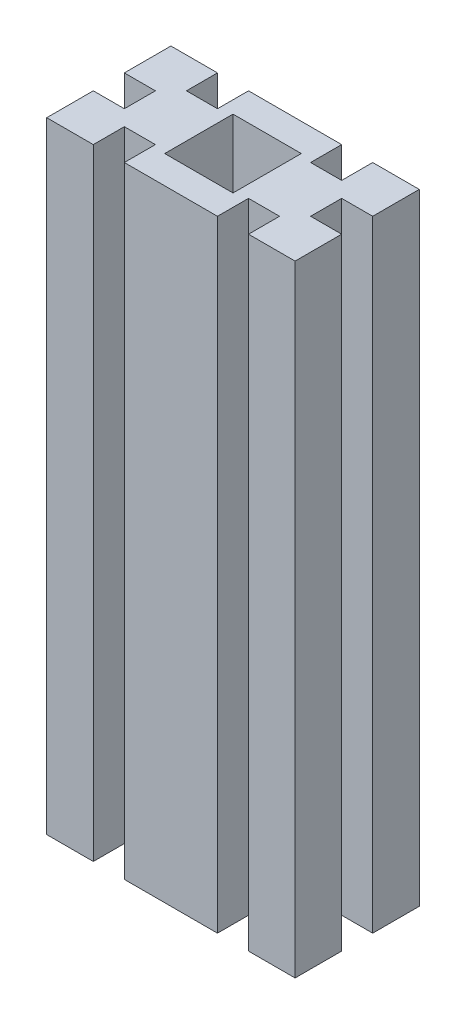
ISO-10303-21;
HEADER;
FILE_DESCRIPTION(('STEP AP214'),'2;1');
FILE_NAME('part.step','',(''),(''),'','','');
FILE_SCHEMA(('AUTOMOTIVE_DESIGN { 1 0 10303 214 1 1 1 1 }'));
ENDSEC;
DATA;
#1=APPLICATION_CONTEXT('core data for automotive mechanical design processes');
#2=APPLICATION_PROTOCOL_DEFINITION('international standard','automotive_design',2000,#1);
#3=PRODUCT_CONTEXT('',#1,'mechanical');
#4=PRODUCT('Part','Part','',(#3));
#5=PRODUCT_RELATED_PRODUCT_CATEGORY('part','',(#4));
#6=PRODUCT_DEFINITION_FORMATION('','',#4);
#7=PRODUCT_DEFINITION_CONTEXT('part definition',#1,'design');
#8=PRODUCT_DEFINITION('design','',#6,#7);
#9=PRODUCT_DEFINITION_SHAPE('','',#8);
#10=(LENGTH_UNIT() NAMED_UNIT(*) SI_UNIT(.MILLI.,.METRE.));
#11=(NAMED_UNIT(*) PLANE_ANGLE_UNIT() SI_UNIT($,.RADIAN.));
#12=(NAMED_UNIT(*) SI_UNIT($,.STERADIAN.) SOLID_ANGLE_UNIT());
#13=UNCERTAINTY_MEASURE_WITH_UNIT(LENGTH_MEASURE(1.E-05),#10,'distance_accuracy_value','');
#14=(GEOMETRIC_REPRESENTATION_CONTEXT(3) GLOBAL_UNCERTAINTY_ASSIGNED_CONTEXT((#13)) GLOBAL_UNIT_ASSIGNED_CONTEXT((#10,
#11,#12)) REPRESENTATION_CONTEXT('',''));
#15=CARTESIAN_POINT('',(0.,0.,0.));
#16=DIRECTION('',(0.,0.,1.));
#17=DIRECTION('',(1.,0.,0.));
#18=AXIS2_PLACEMENT_3D('',#15,#16,#17);
#19=CARTESIAN_POINT('',(-20.,100.,10.));
#20=DIRECTION('',(1.,0.,0.));
#21=DIRECTION('',(0.,0.,-1.));
#22=AXIS2_PLACEMENT_3D('',#19,#20,#21);
#23=PLANE('',#22);
#24=DIRECTION('',(0.,0.,1.));
#25=VECTOR('',#24,1.);
#26=CARTESIAN_POINT('',(-20.,0.,10.));
#27=LINE('',#26,#25);
#28=CARTESIAN_POINT('',(-20.,0.,-10.));
#29=VERTEX_POINT('',#28);
#30=CARTESIAN_POINT('',(-20.,0.,-2.5));
#31=VERTEX_POINT('',#30);
#32=EDGE_CURVE('E316',#29,#31,#27,.T.);
#33=ORIENTED_EDGE('',*,*,#32,.T.);
#34=DIRECTION('',(0.,1.,0.));
#35=VECTOR('',#34,1.);
#36=CARTESIAN_POINT('',(-20.,0.,-2.5));
#37=LINE('',#36,#35);
#38=CARTESIAN_POINT('',(-20.,100.,-2.5));
#39=VERTEX_POINT('',#38);
#40=EDGE_CURVE('E354',#31,#39,#37,.T.);
#41=ORIENTED_EDGE('',*,*,#40,.T.);
#42=DIRECTION('',(0.,0.,1.));
#43=VECTOR('',#42,1.);
#44=CARTESIAN_POINT('',(-20.,100.,10.));
#45=LINE('',#44,#43);
#46=CARTESIAN_POINT('',(-20.,100.,-10.));
#47=VERTEX_POINT('',#46);
#48=EDGE_CURVE('E335',#47,#39,#45,.T.);
#49=ORIENTED_EDGE('',*,*,#48,.F.);
#50=DIRECTION('',(0.,-1.,0.));
#51=VECTOR('',#50,1.);
#52=CARTESIAN_POINT('',(-20.,100.,-10.));
#53=LINE('',#52,#51);
#54=EDGE_CURVE('E279',#47,#29,#53,.T.);
#55=ORIENTED_EDGE('',*,*,#54,.T.);
#56=EDGE_LOOP('',(#33,#41,#49,#55));
#57=FACE_BOUND('',#56,.T.);
#58=ADVANCED_FACE('F33',(#57),#23,.F.);
#59=CARTESIAN_POINT('',(20.,100.,9.99999999999999));
#60=DIRECTION('',(0.,0.,-1.));
#61=DIRECTION('',(-1.,0.,0.));
#62=AXIS2_PLACEMENT_3D('',#59,#60,#61);
#63=PLANE('',#62);
#64=DIRECTION('',(1.,0.,0.));
#65=VECTOR('',#64,1.);
#66=CARTESIAN_POINT('',(20.,0.,9.99999999999999));
#67=LINE('',#66,#65);
#68=CARTESIAN_POINT('',(-20.,0.,10.));
#69=VERTEX_POINT('',#68);
#70=CARTESIAN_POINT('',(-12.5,0.,10.));
#71=VERTEX_POINT('',#70);
#72=EDGE_CURVE('E304',#69,#71,#67,.T.);
#73=ORIENTED_EDGE('',*,*,#72,.T.);
#74=DIRECTION('',(0.,1.,0.));
#75=VECTOR('',#74,1.);
#76=CARTESIAN_POINT('',(-12.5,0.,10.));
#77=LINE('',#76,#75);
#78=CARTESIAN_POINT('',(-12.5,100.,10.));
#79=VERTEX_POINT('',#78);
#80=EDGE_CURVE('E409',#71,#79,#77,.T.);
#81=ORIENTED_EDGE('',*,*,#80,.T.);
#82=DIRECTION('',(1.,0.,0.));
#83=VECTOR('',#82,1.);
#84=CARTESIAN_POINT('',(20.,100.,9.99999999999999));
#85=LINE('',#84,#83);
#86=CARTESIAN_POINT('',(-20.,100.,10.));
#87=VERTEX_POINT('',#86);
#88=EDGE_CURVE('E330',#87,#79,#85,.T.);
#89=ORIENTED_EDGE('',*,*,#88,.F.);
#90=DIRECTION('',(0.,-1.,0.));
#91=VECTOR('',#90,1.);
#92=CARTESIAN_POINT('',(-20.,100.,10.));
#93=LINE('',#92,#91);
#94=EDGE_CURVE('E11',#87,#69,#93,.T.);
#95=ORIENTED_EDGE('',*,*,#94,.T.);
#96=EDGE_LOOP('',(#73,#81,#89,#95));
#97=FACE_BOUND('',#96,.T.);
#98=ADVANCED_FACE('F547',(#97),#63,.F.);
#99=CARTESIAN_POINT('',(-7.5,100.,10.));
#100=VERTEX_POINT('',#99);
#101=CARTESIAN_POINT('',(7.5,100.,10.));
#102=VERTEX_POINT('',#101);
#103=EDGE_CURVE('E333',#100,#102,#85,.T.);
#104=ORIENTED_EDGE('',*,*,#103,.F.);
#105=DIRECTION('',(0.,1.,0.));
#106=VECTOR('',#105,1.);
#107=CARTESIAN_POINT('',(-7.5,0.,10.));
#108=LINE('',#107,#106);
#109=CARTESIAN_POINT('',(-7.5,0.,10.));
#110=VERTEX_POINT('',#109);
#111=EDGE_CURVE('E411',#110,#100,#108,.T.);
#112=ORIENTED_EDGE('',*,*,#111,.F.);
#113=CARTESIAN_POINT('',(7.5,0.,10.));
#114=VERTEX_POINT('',#113);
#115=EDGE_CURVE('E310',#110,#114,#67,.T.);
#116=ORIENTED_EDGE('',*,*,#115,.T.);
#117=DIRECTION('',(0.,1.,0.));
#118=VECTOR('',#117,1.);
#119=CARTESIAN_POINT('',(7.5,0.,10.));
#120=LINE('',#119,#118);
#121=EDGE_CURVE('E391',#114,#102,#120,.T.);
#122=ORIENTED_EDGE('',*,*,#121,.T.);
#123=EDGE_LOOP('',(#104,#112,#116,#122));
#124=FACE_BOUND('',#123,.T.);
#125=ADVANCED_FACE('F535',(#124),#63,.F.);
#126=CARTESIAN_POINT('',(20.,100.,9.99999999999999));
#127=DIRECTION('',(-1.,0.,0.));
#128=DIRECTION('',(0.,0.,1.));
#129=AXIS2_PLACEMENT_3D('',#126,#127,#128);
#130=PLANE('',#129);
#131=DIRECTION('',(0.,0.,-1.));
#132=VECTOR('',#131,1.);
#133=CARTESIAN_POINT('',(20.,100.,9.99999999999999));
#134=LINE('',#133,#132);
#135=CARTESIAN_POINT('',(20.,100.,-2.5));
#136=VERTEX_POINT('',#135);
#137=CARTESIAN_POINT('',(20.,100.,-10.));
#138=VERTEX_POINT('',#137);
#139=EDGE_CURVE('E329',#136,#138,#134,.T.);
#140=ORIENTED_EDGE('',*,*,#139,.F.);
#141=DIRECTION('',(0.,1.,0.));
#142=VECTOR('',#141,1.);
#143=CARTESIAN_POINT('',(20.,0.,-2.5));
#144=LINE('',#143,#142);
#145=CARTESIAN_POINT('',(20.,0.,-2.5));
#146=VERTEX_POINT('',#145);
#147=EDGE_CURVE('E366',#146,#136,#144,.T.);
#148=ORIENTED_EDGE('',*,*,#147,.F.);
#149=DIRECTION('',(0.,0.,-1.));
#150=VECTOR('',#149,1.);
#151=CARTESIAN_POINT('',(20.,0.,9.99999999999999));
#152=LINE('',#151,#150);
#153=CARTESIAN_POINT('',(20.,0.,-10.));
#154=VERTEX_POINT('',#153);
#155=EDGE_CURVE('E303',#146,#154,#152,.T.);
#156=ORIENTED_EDGE('',*,*,#155,.T.);
#157=DIRECTION('',(0.,-1.,0.));
#158=VECTOR('',#157,1.);
#159=CARTESIAN_POINT('',(20.,100.,-10.));
#160=LINE('',#159,#158);
#161=EDGE_CURVE('E282',#138,#154,#160,.T.);
#162=ORIENTED_EDGE('',*,*,#161,.F.);
#163=EDGE_LOOP('',(#140,#148,#156,#162));
#164=FACE_BOUND('',#163,.T.);
#165=ADVANCED_FACE('F516',(#164),#130,.F.);
#166=CARTESIAN_POINT('',(20.,100.,-10.));
#167=DIRECTION('',(0.,0.,1.));
#168=DIRECTION('',(1.,0.,0.));
#169=AXIS2_PLACEMENT_3D('',#166,#167,#168);
#170=PLANE('',#169);
#171=DIRECTION('',(-1.,0.,0.));
#172=VECTOR('',#171,1.);
#173=CARTESIAN_POINT('',(20.,0.,-10.));
#174=LINE('',#173,#172);
#175=CARTESIAN_POINT('',(12.5,0.,-10.));
#176=VERTEX_POINT('',#175);
#177=EDGE_CURVE('E270',#154,#176,#174,.T.);
#178=ORIENTED_EDGE('',*,*,#177,.T.);
#179=DIRECTION('',(0.,1.,0.));
#180=VECTOR('',#179,1.);
#181=CARTESIAN_POINT('',(12.5,0.,-10.));
#182=LINE('',#181,#180);
#183=CARTESIAN_POINT('',(12.5,100.,-10.));
#184=VERTEX_POINT('',#183);
#185=EDGE_CURVE('E378',#176,#184,#182,.T.);
#186=ORIENTED_EDGE('',*,*,#185,.T.);
#187=DIRECTION('',(-1.,0.,0.));
#188=VECTOR('',#187,1.);
#189=CARTESIAN_POINT('',(20.,100.,-10.));
#190=LINE('',#189,#188);
#191=EDGE_CURVE('E283',#138,#184,#190,.T.);
#192=ORIENTED_EDGE('',*,*,#191,.F.);
#193=ORIENTED_EDGE('',*,*,#161,.T.);
#194=EDGE_LOOP('',(#178,#186,#192,#193));
#195=FACE_BOUND('',#194,.T.);
#196=ADVANCED_FACE('F508',(#195),#170,.F.);
#197=CARTESIAN_POINT('',(-12.5,100.,-10.));
#198=VERTEX_POINT('',#197);
#199=EDGE_CURVE('E327',#198,#47,#190,.T.);
#200=ORIENTED_EDGE('',*,*,#199,.F.);
#201=DIRECTION('',(0.,1.,0.));
#202=VECTOR('',#201,1.);
#203=CARTESIAN_POINT('',(-12.5,0.,-10.));
#204=LINE('',#203,#202);
#205=CARTESIAN_POINT('',(-12.5,0.,-10.));
#206=VERTEX_POINT('',#205);
#207=EDGE_CURVE('E323',#206,#198,#204,.T.);
#208=ORIENTED_EDGE('',*,*,#207,.F.);
#209=EDGE_CURVE('E271',#206,#29,#174,.T.);
#210=ORIENTED_EDGE('',*,*,#209,.T.);
#211=ORIENTED_EDGE('',*,*,#54,.F.);
#212=EDGE_LOOP('',(#200,#208,#210,#211));
#213=FACE_BOUND('',#212,.T.);
#214=ADVANCED_FACE('F553',(#213),#170,.F.);
#215=CARTESIAN_POINT('',(-20.,100.,2.5));
#216=VERTEX_POINT('',#215);
#217=EDGE_CURVE('E274',#216,#87,#45,.T.);
#218=ORIENTED_EDGE('',*,*,#217,.F.);
#219=DIRECTION('',(0.,1.,0.));
#220=VECTOR('',#219,1.);
#221=CARTESIAN_POINT('',(-20.,0.,2.5));
#222=LINE('',#221,#220);
#223=CARTESIAN_POINT('',(-20.,0.,2.5));
#224=VERTEX_POINT('',#223);
#225=EDGE_CURVE('E434',#224,#216,#222,.T.);
#226=ORIENTED_EDGE('',*,*,#225,.F.);
#227=EDGE_CURVE('E319',#224,#69,#27,.T.);
#228=ORIENTED_EDGE('',*,*,#227,.T.);
#229=ORIENTED_EDGE('',*,*,#94,.F.);
#230=EDGE_LOOP('',(#218,#226,#228,#229));
#231=FACE_BOUND('',#230,.T.);
#232=ADVANCED_FACE('F35',(#231),#23,.F.);
#233=CARTESIAN_POINT('',(12.5,100.,10.));
#234=VERTEX_POINT('',#233);
#235=CARTESIAN_POINT('',(20.,100.,9.99999999999999));
#236=VERTEX_POINT('',#235);
#237=EDGE_CURVE('E334',#234,#236,#85,.T.);
#238=ORIENTED_EDGE('',*,*,#237,.F.);
#239=DIRECTION('',(0.,1.,0.));
#240=VECTOR('',#239,1.);
#241=CARTESIAN_POINT('',(12.5,0.,10.));
#242=LINE('',#241,#240);
#243=CARTESIAN_POINT('',(12.5,0.,10.));
#244=VERTEX_POINT('',#243);
#245=EDGE_CURVE('E384',#244,#234,#242,.T.);
#246=ORIENTED_EDGE('',*,*,#245,.F.);
#247=CARTESIAN_POINT('',(20.,0.,9.99999999999999));
#248=VERTEX_POINT('',#247);
#249=EDGE_CURVE('E300',#244,#248,#67,.T.);
#250=ORIENTED_EDGE('',*,*,#249,.T.);
#251=DIRECTION('',(0.,-1.,0.));
#252=VECTOR('',#251,1.);
#253=CARTESIAN_POINT('',(20.,100.,9.99999999999999));
#254=LINE('',#253,#252);
#255=EDGE_CURVE('E41',#236,#248,#254,.T.);
#256=ORIENTED_EDGE('',*,*,#255,.F.);
#257=EDGE_LOOP('',(#238,#246,#250,#256));
#258=FACE_BOUND('',#257,.T.);
#259=ADVANCED_FACE('F545',(#258),#63,.F.);
#260=CARTESIAN_POINT('',(20.,0.,2.5));
#261=VERTEX_POINT('',#260);
#262=EDGE_CURVE('E275',#248,#261,#152,.T.);
#263=ORIENTED_EDGE('',*,*,#262,.T.);
#264=DIRECTION('',(0.,1.,0.));
#265=VECTOR('',#264,1.);
#266=CARTESIAN_POINT('',(20.,0.,2.5));
#267=LINE('',#266,#265);
#268=CARTESIAN_POINT('',(20.,100.,2.5));
#269=VERTEX_POINT('',#268);
#270=EDGE_CURVE('E364',#261,#269,#267,.T.);
#271=ORIENTED_EDGE('',*,*,#270,.T.);
#272=EDGE_CURVE('E294',#236,#269,#134,.T.);
#273=ORIENTED_EDGE('',*,*,#272,.F.);
#274=ORIENTED_EDGE('',*,*,#255,.T.);
#275=EDGE_LOOP('',(#263,#271,#273,#274));
#276=FACE_BOUND('',#275,.T.);
#277=ADVANCED_FACE('F291',(#276),#130,.F.);
#278=CARTESIAN_POINT('',(7.5,100.,-10.));
#279=VERTEX_POINT('',#278);
#280=CARTESIAN_POINT('',(-7.5,100.,-10.));
#281=VERTEX_POINT('',#280);
#282=EDGE_CURVE('E262',#279,#281,#190,.T.);
#283=ORIENTED_EDGE('',*,*,#282,.F.);
#284=DIRECTION('',(0.,1.,0.));
#285=VECTOR('',#284,1.);
#286=CARTESIAN_POINT('',(7.5,0.,-10.));
#287=LINE('',#286,#285);
#288=CARTESIAN_POINT('',(7.5,0.,-10.));
#289=VERTEX_POINT('',#288);
#290=EDGE_CURVE('E246',#289,#279,#287,.T.);
#291=ORIENTED_EDGE('',*,*,#290,.F.);
#292=CARTESIAN_POINT('',(-7.5,0.,-10.));
#293=VERTEX_POINT('',#292);
#294=EDGE_CURVE('E260',#289,#293,#174,.T.);
#295=ORIENTED_EDGE('',*,*,#294,.T.);
#296=DIRECTION('',(0.,1.,0.));
#297=VECTOR('',#296,1.);
#298=CARTESIAN_POINT('',(-7.5,0.,-10.));
#299=LINE('',#298,#297);
#300=EDGE_CURVE('E342',#293,#281,#299,.T.);
#301=ORIENTED_EDGE('',*,*,#300,.T.);
#302=EDGE_LOOP('',(#283,#291,#295,#301));
#303=FACE_BOUND('',#302,.T.);
#304=ADVANCED_FACE('F258',(#303),#170,.F.);
#305=CARTESIAN_POINT('',(0.,100.,0.));
#306=DIRECTION('',(0.,1.,0.));
#307=DIRECTION('',(0.,0.,1.));
#308=AXIS2_PLACEMENT_3D('',#305,#306,#307);
#309=PLANE('',#308);
#310=DIRECTION('',(-1.,0.,0.));
#311=VECTOR('',#310,1.);
#312=CARTESIAN_POINT('',(-20.,100.,-2.5));
#313=LINE('',#312,#311);
#314=CARTESIAN_POINT('',(-15.,100.,-2.5));
#315=VERTEX_POINT('',#314);
#316=EDGE_CURVE('E442',#315,#39,#313,.T.);
#317=ORIENTED_EDGE('',*,*,#316,.F.);
#318=DIRECTION('',(0.,0.,-1.));
#319=VECTOR('',#318,1.);
#320=CARTESIAN_POINT('',(-15.,100.,-2.5));
#321=LINE('',#320,#319);
#322=CARTESIAN_POINT('',(-15.,100.,2.5));
#323=VERTEX_POINT('',#322);
#324=EDGE_CURVE('E445',#323,#315,#321,.T.);
#325=ORIENTED_EDGE('',*,*,#324,.F.);
#326=DIRECTION('',(1.,0.,0.));
#327=VECTOR('',#326,1.);
#328=CARTESIAN_POINT('',(-20.,100.,2.5));
#329=LINE('',#328,#327);
#330=EDGE_CURVE('E418',#216,#323,#329,.T.);
#331=ORIENTED_EDGE('',*,*,#330,.F.);
#332=ORIENTED_EDGE('',*,*,#217,.T.);
#333=ORIENTED_EDGE('',*,*,#88,.T.);
#334=DIRECTION('',(0.,0.,1.));
#335=VECTOR('',#334,1.);
#336=CARTESIAN_POINT('',(-12.5,100.,10.));
#337=LINE('',#336,#335);
#338=CARTESIAN_POINT('',(-12.5,100.,5.));
#339=VERTEX_POINT('',#338);
#340=EDGE_CURVE('E394',#339,#79,#337,.T.);
#341=ORIENTED_EDGE('',*,*,#340,.F.);
#342=DIRECTION('',(-1.,0.,0.));
#343=VECTOR('',#342,1.);
#344=CARTESIAN_POINT('',(-12.5,100.,5.));
#345=LINE('',#344,#343);
#346=CARTESIAN_POINT('',(-7.5,100.,5.));
#347=VERTEX_POINT('',#346);
#348=EDGE_CURVE('E419',#347,#339,#345,.T.);
#349=ORIENTED_EDGE('',*,*,#348,.F.);
#350=DIRECTION('',(0.,0.,-1.));
#351=VECTOR('',#350,1.);
#352=CARTESIAN_POINT('',(-7.5,100.,10.));
#353=LINE('',#352,#351);
#354=EDGE_CURVE('E423',#100,#347,#353,.T.);
#355=ORIENTED_EDGE('',*,*,#354,.F.);
#356=ORIENTED_EDGE('',*,*,#103,.T.);
#357=DIRECTION('',(0.,0.,1.));
#358=VECTOR('',#357,1.);
#359=CARTESIAN_POINT('',(7.5,100.,10.));
#360=LINE('',#359,#358);
#361=CARTESIAN_POINT('',(7.5,100.,5.));
#362=VERTEX_POINT('',#361);
#363=EDGE_CURVE('E395',#362,#102,#360,.T.);
#364=ORIENTED_EDGE('',*,*,#363,.F.);
#365=DIRECTION('',(-1.,0.,0.));
#366=VECTOR('',#365,1.);
#367=CARTESIAN_POINT('',(12.5,100.,5.));
#368=LINE('',#367,#366);
#369=CARTESIAN_POINT('',(12.5,100.,5.));
#370=VERTEX_POINT('',#369);
#371=EDGE_CURVE('E398',#370,#362,#368,.T.);
#372=ORIENTED_EDGE('',*,*,#371,.F.);
#373=DIRECTION('',(0.,0.,-1.));
#374=VECTOR('',#373,1.);
#375=CARTESIAN_POINT('',(12.5,100.,10.));
#376=LINE('',#375,#374);
#377=EDGE_CURVE('E368',#234,#370,#376,.T.);
#378=ORIENTED_EDGE('',*,*,#377,.F.);
#379=ORIENTED_EDGE('',*,*,#237,.T.);
#380=ORIENTED_EDGE('',*,*,#272,.T.);
#381=DIRECTION('',(1.,0.,0.));
#382=VECTOR('',#381,1.);
#383=CARTESIAN_POINT('',(20.,100.,2.5));
#384=LINE('',#383,#382);
#385=CARTESIAN_POINT('',(15.,100.,2.5));
#386=VERTEX_POINT('',#385);
#387=EDGE_CURVE('E369',#386,#269,#384,.T.);
#388=ORIENTED_EDGE('',*,*,#387,.F.);
#389=DIRECTION('',(0.,0.,1.));
#390=VECTOR('',#389,1.);
#391=CARTESIAN_POINT('',(15.,100.,-2.5));
#392=LINE('',#391,#390);
#393=CARTESIAN_POINT('',(15.,100.,-2.5));
#394=VERTEX_POINT('',#393);
#395=EDGE_CURVE('E372',#394,#386,#392,.T.);
#396=ORIENTED_EDGE('',*,*,#395,.F.);
#397=DIRECTION('',(-1.,0.,0.));
#398=VECTOR('',#397,1.);
#399=CARTESIAN_POINT('',(20.,100.,-2.5));
#400=LINE('',#399,#398);
#401=EDGE_CURVE('E375',#136,#394,#400,.T.);
#402=ORIENTED_EDGE('',*,*,#401,.F.);
#403=ORIENTED_EDGE('',*,*,#139,.T.);
#404=ORIENTED_EDGE('',*,*,#191,.T.);
#405=DIRECTION('',(0.,0.,-1.));
#406=VECTOR('',#405,1.);
#407=CARTESIAN_POINT('',(12.5,100.,-10.));
#408=LINE('',#407,#406);
#409=CARTESIAN_POINT('',(12.5,100.,-5.00000000000001));
#410=VERTEX_POINT('',#409);
#411=EDGE_CURVE('E253',#410,#184,#408,.T.);
#412=ORIENTED_EDGE('',*,*,#411,.F.);
#413=DIRECTION('',(1.,0.,0.));
#414=VECTOR('',#413,1.);
#415=CARTESIAN_POINT('',(12.5,100.,-5.00000000000001));
#416=LINE('',#415,#414);
#417=CARTESIAN_POINT('',(7.5,100.,-5.00000000000001));
#418=VERTEX_POINT('',#417);
#419=EDGE_CURVE('E492',#418,#410,#416,.T.);
#420=ORIENTED_EDGE('',*,*,#419,.F.);
#421=DIRECTION('',(0.,0.,1.));
#422=VECTOR('',#421,1.);
#423=CARTESIAN_POINT('',(7.5,100.,-10.));
#424=LINE('',#423,#422);
#425=EDGE_CURVE('E464',#279,#418,#424,.T.);
#426=ORIENTED_EDGE('',*,*,#425,.F.);
#427=ORIENTED_EDGE('',*,*,#282,.T.);
#428=DIRECTION('',(0.,0.,-1.));
#429=VECTOR('',#428,1.);
#430=CARTESIAN_POINT('',(-7.5,100.,-10.));
#431=LINE('',#430,#429);
#432=CARTESIAN_POINT('',(-7.5,100.,-5.00000000000001));
#433=VERTEX_POINT('',#432);
#434=EDGE_CURVE('E345',#433,#281,#431,.T.);
#435=ORIENTED_EDGE('',*,*,#434,.F.);
#436=DIRECTION('',(1.,0.,0.));
#437=VECTOR('',#436,1.);
#438=CARTESIAN_POINT('',(-12.5,100.,-5.00000000000001));
#439=LINE('',#438,#437);
#440=CARTESIAN_POINT('',(-12.5,100.,-5.00000000000001));
#441=VERTEX_POINT('',#440);
#442=EDGE_CURVE('E348',#441,#433,#439,.T.);
#443=ORIENTED_EDGE('',*,*,#442,.F.);
#444=DIRECTION('',(0.,0.,1.));
#445=VECTOR('',#444,1.);
#446=CARTESIAN_POINT('',(-12.5,100.,-10.));
#447=LINE('',#446,#445);
#448=EDGE_CURVE('E351',#198,#441,#447,.T.);
#449=ORIENTED_EDGE('',*,*,#448,.F.);
#450=ORIENTED_EDGE('',*,*,#199,.T.);
#451=ORIENTED_EDGE('',*,*,#48,.T.);
#452=EDGE_LOOP('',(#317,#325,#331,#332,#333,#341,#349,#355,#356,#364,#372,#378,#379,#380,#388,
#396,#402,#403,#404,#412,#420,#426,#427,#435,#443,#449,#450,#451));
#453=FACE_BOUND('',#452,.T.);
#454=DIRECTION('',(0.,0.,1.));
#455=VECTOR('',#454,1.);
#456=CARTESIAN_POINT('',(-5.5,100.,-5.5));
#457=LINE('',#456,#455);
#458=CARTESIAN_POINT('',(-5.5,100.,-5.5));
#459=VERTEX_POINT('',#458);
#460=CARTESIAN_POINT('',(-5.5,100.,5.5));
#461=VERTEX_POINT('',#460);
#462=EDGE_CURVE('E48',#459,#461,#457,.T.);
#463=ORIENTED_EDGE('',*,*,#462,.F.);
#464=DIRECTION('',(-1.,0.,0.));
#465=VECTOR('',#464,1.);
#466=CARTESIAN_POINT('',(5.5,100.,-5.5));
#467=LINE('',#466,#465);
#468=CARTESIAN_POINT('',(5.5,100.,-5.5));
#469=VERTEX_POINT('',#468);
#470=EDGE_CURVE('E465',#469,#459,#467,.T.);
#471=ORIENTED_EDGE('',*,*,#470,.F.);
#472=DIRECTION('',(0.,0.,-1.));
#473=VECTOR('',#472,1.);
#474=CARTESIAN_POINT('',(5.5,100.,-5.5));
#475=LINE('',#474,#473);
#476=CARTESIAN_POINT('',(5.5,100.,5.5));
#477=VERTEX_POINT('',#476);
#478=EDGE_CURVE('E469',#477,#469,#475,.T.);
#479=ORIENTED_EDGE('',*,*,#478,.F.);
#480=DIRECTION('',(1.,0.,0.));
#481=VECTOR('',#480,1.);
#482=CARTESIAN_POINT('',(5.5,100.,5.5));
#483=LINE('',#482,#481);
#484=EDGE_CURVE('E472',#461,#477,#483,.T.);
#485=ORIENTED_EDGE('',*,*,#484,.F.);
#486=EDGE_LOOP('',(#463,#471,#479,#485));
#487=FACE_BOUND('',#486,.T.);
#488=ADVANCED_FACE('F511',(#453,#487),#309,.T.);
#489=CARTESIAN_POINT('',(0.,0.,0.));
#490=DIRECTION('',(0.,1.,0.));
#491=DIRECTION('',(0.,0.,1.));
#492=AXIS2_PLACEMENT_3D('',#489,#490,#491);
#493=PLANE('',#492);
#494=DIRECTION('',(0.,0.,-1.));
#495=VECTOR('',#494,1.);
#496=CARTESIAN_POINT('',(-15.,0.,-2.5));
#497=LINE('',#496,#495);
#498=CARTESIAN_POINT('',(-15.,0.,2.5));
#499=VERTEX_POINT('',#498);
#500=CARTESIAN_POINT('',(-15.,0.,-2.5));
#501=VERTEX_POINT('',#500);
#502=EDGE_CURVE('E56',#499,#501,#497,.T.);
#503=ORIENTED_EDGE('',*,*,#502,.T.);
#504=DIRECTION('',(-1.,0.,0.));
#505=VECTOR('',#504,1.);
#506=CARTESIAN_POINT('',(-20.,0.,-2.5));
#507=LINE('',#506,#505);
#508=EDGE_CURVE('E437',#501,#31,#507,.T.);
#509=ORIENTED_EDGE('',*,*,#508,.T.);
#510=ORIENTED_EDGE('',*,*,#32,.F.);
#511=ORIENTED_EDGE('',*,*,#209,.F.);
#512=DIRECTION('',(0.,0.,1.));
#513=VECTOR('',#512,1.);
#514=CARTESIAN_POINT('',(-12.5,0.,-10.));
#515=LINE('',#514,#513);
#516=CARTESIAN_POINT('',(-12.5,0.,-5.00000000000001));
#517=VERTEX_POINT('',#516);
#518=EDGE_CURVE('E347',#206,#517,#515,.T.);
#519=ORIENTED_EDGE('',*,*,#518,.T.);
#520=DIRECTION('',(1.,0.,0.));
#521=VECTOR('',#520,1.);
#522=CARTESIAN_POINT('',(-12.5,0.,-5.00000000000001));
#523=LINE('',#522,#521);
#524=CARTESIAN_POINT('',(-7.5,0.,-5.00000000000001));
#525=VERTEX_POINT('',#524);
#526=EDGE_CURVE('E356',#517,#525,#523,.T.);
#527=ORIENTED_EDGE('',*,*,#526,.T.);
#528=DIRECTION('',(0.,0.,-1.));
#529=VECTOR('',#528,1.);
#530=CARTESIAN_POINT('',(-7.5,0.,-10.));
#531=LINE('',#530,#529);
#532=EDGE_CURVE('E269',#525,#293,#531,.T.);
#533=ORIENTED_EDGE('',*,*,#532,.T.);
#534=ORIENTED_EDGE('',*,*,#294,.F.);
#535=DIRECTION('',(0.,0.,1.));
#536=VECTOR('',#535,1.);
#537=CARTESIAN_POINT('',(7.5,0.,-10.));
#538=LINE('',#537,#536);
#539=CARTESIAN_POINT('',(7.5,0.,-5.00000000000001));
#540=VERTEX_POINT('',#539);
#541=EDGE_CURVE('E242',#289,#540,#538,.T.);
#542=ORIENTED_EDGE('',*,*,#541,.T.);
#543=DIRECTION('',(1.,0.,0.));
#544=VECTOR('',#543,1.);
#545=CARTESIAN_POINT('',(12.5,0.,-5.00000000000001));
#546=LINE('',#545,#544);
#547=CARTESIAN_POINT('',(12.5,0.,-5.00000000000001));
#548=VERTEX_POINT('',#547);
#549=EDGE_CURVE('E252',#540,#548,#546,.T.);
#550=ORIENTED_EDGE('',*,*,#549,.T.);
#551=DIRECTION('',(0.,0.,-1.));
#552=VECTOR('',#551,1.);
#553=CARTESIAN_POINT('',(12.5,0.,-10.));
#554=LINE('',#553,#552);
#555=EDGE_CURVE('E263',#548,#176,#554,.T.);
#556=ORIENTED_EDGE('',*,*,#555,.T.);
#557=ORIENTED_EDGE('',*,*,#177,.F.);
#558=ORIENTED_EDGE('',*,*,#155,.F.);
#559=DIRECTION('',(-1.,0.,0.));
#560=VECTOR('',#559,1.);
#561=CARTESIAN_POINT('',(20.,0.,-2.5));
#562=LINE('',#561,#560);
#563=CARTESIAN_POINT('',(15.,0.,-2.5));
#564=VERTEX_POINT('',#563);
#565=EDGE_CURVE('E371',#146,#564,#562,.T.);
#566=ORIENTED_EDGE('',*,*,#565,.T.);
#567=DIRECTION('',(0.,0.,1.));
#568=VECTOR('',#567,1.);
#569=CARTESIAN_POINT('',(15.,0.,-2.5));
#570=LINE('',#569,#568);
#571=CARTESIAN_POINT('',(15.,0.,2.5));
#572=VERTEX_POINT('',#571);
#573=EDGE_CURVE('E380',#564,#572,#570,.T.);
#574=ORIENTED_EDGE('',*,*,#573,.T.);
#575=DIRECTION('',(1.,0.,0.));
#576=VECTOR('',#575,1.);
#577=CARTESIAN_POINT('',(20.,0.,2.5));
#578=LINE('',#577,#576);
#579=EDGE_CURVE('E302',#572,#261,#578,.T.);
#580=ORIENTED_EDGE('',*,*,#579,.T.);
#581=ORIENTED_EDGE('',*,*,#262,.F.);
#582=ORIENTED_EDGE('',*,*,#249,.F.);
#583=DIRECTION('',(0.,0.,-1.));
#584=VECTOR('',#583,1.);
#585=CARTESIAN_POINT('',(12.5,0.,10.));
#586=LINE('',#585,#584);
#587=CARTESIAN_POINT('',(12.5,0.,5.));
#588=VERTEX_POINT('',#587);
#589=EDGE_CURVE('E397',#244,#588,#586,.T.);
#590=ORIENTED_EDGE('',*,*,#589,.T.);
#591=DIRECTION('',(-1.,0.,0.));
#592=VECTOR('',#591,1.);
#593=CARTESIAN_POINT('',(12.5,0.,5.));
#594=LINE('',#593,#592);
#595=CARTESIAN_POINT('',(7.5,0.,5.));
#596=VERTEX_POINT('',#595);
#597=EDGE_CURVE('E405',#588,#596,#594,.T.);
#598=ORIENTED_EDGE('',*,*,#597,.T.);
#599=DIRECTION('',(0.,0.,1.));
#600=VECTOR('',#599,1.);
#601=CARTESIAN_POINT('',(7.5,0.,10.));
#602=LINE('',#601,#600);
#603=EDGE_CURVE('E387',#596,#114,#602,.T.);
#604=ORIENTED_EDGE('',*,*,#603,.T.);
#605=ORIENTED_EDGE('',*,*,#115,.F.);
#606=DIRECTION('',(0.,0.,-1.));
#607=VECTOR('',#606,1.);
#608=CARTESIAN_POINT('',(-7.5,0.,10.));
#609=LINE('',#608,#607);
#610=CARTESIAN_POINT('',(-7.5,0.,5.));
#611=VERTEX_POINT('',#610);
#612=EDGE_CURVE('E429',#110,#611,#609,.T.);
#613=ORIENTED_EDGE('',*,*,#612,.T.);
#614=DIRECTION('',(-1.,0.,0.));
#615=VECTOR('',#614,1.);
#616=CARTESIAN_POINT('',(-12.5,0.,5.));
#617=LINE('',#616,#615);
#618=CARTESIAN_POINT('',(-12.5,0.,5.));
#619=VERTEX_POINT('',#618);
#620=EDGE_CURVE('E412',#611,#619,#617,.T.);
#621=ORIENTED_EDGE('',*,*,#620,.T.);
#622=DIRECTION('',(0.,0.,1.));
#623=VECTOR('',#622,1.);
#624=CARTESIAN_POINT('',(-12.5,0.,10.));
#625=LINE('',#624,#623);
#626=EDGE_CURVE('E422',#619,#71,#625,.T.);
#627=ORIENTED_EDGE('',*,*,#626,.T.);
#628=ORIENTED_EDGE('',*,*,#72,.F.);
#629=ORIENTED_EDGE('',*,*,#227,.F.);
#630=DIRECTION('',(1.,0.,0.));
#631=VECTOR('',#630,1.);
#632=CARTESIAN_POINT('',(-20.,0.,2.5));
#633=LINE('',#632,#631);
#634=EDGE_CURVE('E444',#224,#499,#633,.T.);
#635=ORIENTED_EDGE('',*,*,#634,.T.);
#636=EDGE_LOOP('',(#503,#509,#510,#511,#519,#527,#533,#534,#542,#550,#556,#557,#558,#566,#574,
#580,#581,#582,#590,#598,#604,#605,#613,#621,#627,#628,#629,#635));
#637=FACE_BOUND('',#636,.T.);
#638=DIRECTION('',(-1.,0.,0.));
#639=VECTOR('',#638,1.);
#640=CARTESIAN_POINT('',(5.5,0.,-5.5));
#641=LINE('',#640,#639);
#642=CARTESIAN_POINT('',(5.5,0.,-5.5));
#643=VERTEX_POINT('',#642);
#644=CARTESIAN_POINT('',(-5.5,0.,-5.5));
#645=VERTEX_POINT('',#644);
#646=EDGE_CURVE('E458',#643,#645,#641,.T.);
#647=ORIENTED_EDGE('',*,*,#646,.T.);
#648=DIRECTION('',(0.,0.,1.));
#649=VECTOR('',#648,1.);
#650=CARTESIAN_POINT('',(-5.5,0.,-5.5));
#651=LINE('',#650,#649);
#652=CARTESIAN_POINT('',(-5.5,0.,5.5));
#653=VERTEX_POINT('',#652);
#654=EDGE_CURVE('E468',#645,#653,#651,.T.);
#655=ORIENTED_EDGE('',*,*,#654,.T.);
#656=DIRECTION('',(1.,0.,0.));
#657=VECTOR('',#656,1.);
#658=CARTESIAN_POINT('',(5.5,0.,5.5));
#659=LINE('',#658,#657);
#660=CARTESIAN_POINT('',(5.5,0.,5.5));
#661=VERTEX_POINT('',#660);
#662=EDGE_CURVE('E481',#653,#661,#659,.T.);
#663=ORIENTED_EDGE('',*,*,#662,.T.);
#664=DIRECTION('',(0.,0.,-1.));
#665=VECTOR('',#664,1.);
#666=CARTESIAN_POINT('',(5.5,0.,-5.5));
#667=LINE('',#666,#665);
#668=EDGE_CURVE('E478',#661,#643,#667,.T.);
#669=ORIENTED_EDGE('',*,*,#668,.T.);
#670=EDGE_LOOP('',(#647,#655,#663,#669));
#671=FACE_BOUND('',#670,.T.);
#672=ADVANCED_FACE('F266',(#637,#671),#493,.F.);
#673=CARTESIAN_POINT('',(-12.5,0.,-10.));
#674=DIRECTION('',(-1.,0.,0.));
#675=DIRECTION('',(0.,0.,1.));
#676=AXIS2_PLACEMENT_3D('',#673,#674,#675);
#677=PLANE('',#676);
#678=ORIENTED_EDGE('',*,*,#448,.T.);
#679=DIRECTION('',(0.,1.,0.));
#680=VECTOR('',#679,1.);
#681=CARTESIAN_POINT('',(-12.5,0.,-5.00000000000001));
#682=LINE('',#681,#680);
#683=EDGE_CURVE('E338',#517,#441,#682,.T.);
#684=ORIENTED_EDGE('',*,*,#683,.F.);
#685=ORIENTED_EDGE('',*,*,#518,.F.);
#686=ORIENTED_EDGE('',*,*,#207,.T.);
#687=EDGE_LOOP('',(#678,#684,#685,#686));
#688=FACE_BOUND('',#687,.T.);
#689=ADVANCED_FACE('F623',(#688),#677,.F.);
#690=CARTESIAN_POINT('',(-7.5,0.,-10.));
#691=DIRECTION('',(1.,0.,0.));
#692=DIRECTION('',(0.,0.,-1.));
#693=AXIS2_PLACEMENT_3D('',#690,#691,#692);
#694=PLANE('',#693);
#695=ORIENTED_EDGE('',*,*,#434,.T.);
#696=ORIENTED_EDGE('',*,*,#300,.F.);
#697=ORIENTED_EDGE('',*,*,#532,.F.);
#698=DIRECTION('',(0.,1.,0.));
#699=VECTOR('',#698,1.);
#700=CARTESIAN_POINT('',(-7.5,0.,-5.00000000000001));
#701=LINE('',#700,#699);
#702=EDGE_CURVE('E340',#525,#433,#701,.T.);
#703=ORIENTED_EDGE('',*,*,#702,.T.);
#704=EDGE_LOOP('',(#695,#696,#697,#703));
#705=FACE_BOUND('',#704,.T.);
#706=ADVANCED_FACE('F632',(#705),#694,.F.);
#707=CARTESIAN_POINT('',(-12.5,0.,-5.00000000000001));
#708=DIRECTION('',(0.,0.,1.));
#709=DIRECTION('',(1.,0.,0.));
#710=AXIS2_PLACEMENT_3D('',#707,#708,#709);
#711=PLANE('',#710);
#712=ORIENTED_EDGE('',*,*,#442,.T.);
#713=ORIENTED_EDGE('',*,*,#702,.F.);
#714=ORIENTED_EDGE('',*,*,#526,.F.);
#715=ORIENTED_EDGE('',*,*,#683,.T.);
#716=EDGE_LOOP('',(#712,#713,#714,#715));
#717=FACE_BOUND('',#716,.T.);
#718=ADVANCED_FACE('F642',(#717),#711,.F.);
#719=CARTESIAN_POINT('',(-5.5,0.,-5.5));
#720=DIRECTION('',(-1.,0.,0.));
#721=DIRECTION('',(0.,0.,1.));
#722=AXIS2_PLACEMENT_3D('',#719,#720,#721);
#723=PLANE('',#722);
#724=ORIENTED_EDGE('',*,*,#462,.T.);
#725=DIRECTION('',(0.,1.,0.));
#726=VECTOR('',#725,1.);
#727=CARTESIAN_POINT('',(-5.5,0.,5.5));
#728=LINE('',#727,#726);
#729=EDGE_CURVE('E455',#653,#461,#728,.T.);
#730=ORIENTED_EDGE('',*,*,#729,.F.);
#731=ORIENTED_EDGE('',*,*,#654,.F.);
#732=DIRECTION('',(0.,1.,0.));
#733=VECTOR('',#732,1.);
#734=CARTESIAN_POINT('',(-5.5,0.,-5.5));
#735=LINE('',#734,#733);
#736=EDGE_CURVE('E462',#645,#459,#735,.T.);
#737=ORIENTED_EDGE('',*,*,#736,.T.);
#738=EDGE_LOOP('',(#724,#730,#731,#737));
#739=FACE_BOUND('',#738,.T.);
#740=ADVANCED_FACE('F652',(#739),#723,.F.);
#741=CARTESIAN_POINT('',(5.5,0.,-5.5));
#742=DIRECTION('',(0.,0.,-1.));
#743=DIRECTION('',(-1.,0.,0.));
#744=AXIS2_PLACEMENT_3D('',#741,#742,#743);
#745=PLANE('',#744);
#746=ORIENTED_EDGE('',*,*,#470,.T.);
#747=ORIENTED_EDGE('',*,*,#736,.F.);
#748=ORIENTED_EDGE('',*,*,#646,.F.);
#749=DIRECTION('',(0.,1.,0.));
#750=VECTOR('',#749,1.);
#751=CARTESIAN_POINT('',(5.5,0.,-5.5));
#752=LINE('',#751,#750);
#753=EDGE_CURVE('E460',#643,#469,#752,.T.);
#754=ORIENTED_EDGE('',*,*,#753,.T.);
#755=EDGE_LOOP('',(#746,#747,#748,#754));
#756=FACE_BOUND('',#755,.T.);
#757=ADVANCED_FACE('F662',(#756),#745,.F.);
#758=CARTESIAN_POINT('',(5.5,0.,-5.5));
#759=DIRECTION('',(1.,0.,0.));
#760=DIRECTION('',(0.,0.,-1.));
#761=AXIS2_PLACEMENT_3D('',#758,#759,#760);
#762=PLANE('',#761);
#763=ORIENTED_EDGE('',*,*,#478,.T.);
#764=ORIENTED_EDGE('',*,*,#753,.F.);
#765=ORIENTED_EDGE('',*,*,#668,.F.);
#766=DIRECTION('',(0.,1.,0.));
#767=VECTOR('',#766,1.);
#768=CARTESIAN_POINT('',(5.5,0.,5.5));
#769=LINE('',#768,#767);
#770=EDGE_CURVE('E457',#661,#477,#769,.T.);
#771=ORIENTED_EDGE('',*,*,#770,.T.);
#772=EDGE_LOOP('',(#763,#764,#765,#771));
#773=FACE_BOUND('',#772,.T.);
#774=ADVANCED_FACE('F671',(#773),#762,.F.);
#775=CARTESIAN_POINT('',(5.5,0.,5.5));
#776=DIRECTION('',(0.,0.,1.));
#777=DIRECTION('',(1.,0.,0.));
#778=AXIS2_PLACEMENT_3D('',#775,#776,#777);
#779=PLANE('',#778);
#780=ORIENTED_EDGE('',*,*,#484,.T.);
#781=ORIENTED_EDGE('',*,*,#770,.F.);
#782=ORIENTED_EDGE('',*,*,#662,.F.);
#783=ORIENTED_EDGE('',*,*,#729,.T.);
#784=EDGE_LOOP('',(#780,#781,#782,#783));
#785=FACE_BOUND('',#784,.T.);
#786=ADVANCED_FACE('F681',(#785),#779,.F.);
#787=CARTESIAN_POINT('',(12.5,0.,-10.));
#788=DIRECTION('',(1.,0.,0.));
#789=DIRECTION('',(0.,0.,-1.));
#790=AXIS2_PLACEMENT_3D('',#787,#788,#789);
#791=PLANE('',#790);
#792=ORIENTED_EDGE('',*,*,#411,.T.);
#793=ORIENTED_EDGE('',*,*,#185,.F.);
#794=ORIENTED_EDGE('',*,*,#555,.F.);
#795=DIRECTION('',(0.,1.,0.));
#796=VECTOR('',#795,1.);
#797=CARTESIAN_POINT('',(12.5,0.,-5.00000000000001));
#798=LINE('',#797,#796);
#799=EDGE_CURVE('E487',#548,#410,#798,.T.);
#800=ORIENTED_EDGE('',*,*,#799,.T.);
#801=EDGE_LOOP('',(#792,#793,#794,#800));
#802=FACE_BOUND('',#801,.T.);
#803=ADVANCED_FACE('F505',(#802),#791,.F.);
#804=CARTESIAN_POINT('',(12.5,0.,-5.00000000000001));
#805=DIRECTION('',(0.,0.,1.));
#806=DIRECTION('',(1.,0.,0.));
#807=AXIS2_PLACEMENT_3D('',#804,#805,#806);
#808=PLANE('',#807);
#809=ORIENTED_EDGE('',*,*,#419,.T.);
#810=ORIENTED_EDGE('',*,*,#799,.F.);
#811=ORIENTED_EDGE('',*,*,#549,.F.);
#812=DIRECTION('',(0.,1.,0.));
#813=VECTOR('',#812,1.);
#814=CARTESIAN_POINT('',(7.5,0.,-5.00000000000001));
#815=LINE('',#814,#813);
#816=EDGE_CURVE('E248',#540,#418,#815,.T.);
#817=ORIENTED_EDGE('',*,*,#816,.T.);
#818=EDGE_LOOP('',(#809,#810,#811,#817));
#819=FACE_BOUND('',#818,.T.);
#820=ADVANCED_FACE('F501',(#819),#808,.F.);
#821=CARTESIAN_POINT('',(7.5,0.,-10.));
#822=DIRECTION('',(-1.,0.,0.));
#823=DIRECTION('',(0.,0.,1.));
#824=AXIS2_PLACEMENT_3D('',#821,#822,#823);
#825=PLANE('',#824);
#826=ORIENTED_EDGE('',*,*,#425,.T.);
#827=ORIENTED_EDGE('',*,*,#816,.F.);
#828=ORIENTED_EDGE('',*,*,#541,.F.);
#829=ORIENTED_EDGE('',*,*,#290,.T.);
#830=EDGE_LOOP('',(#826,#827,#828,#829));
#831=FACE_BOUND('',#830,.T.);
#832=ADVANCED_FACE('F245',(#831),#825,.F.);
#833=CARTESIAN_POINT('',(20.,0.,-2.5));
#834=DIRECTION('',(0.,0.,-1.));
#835=DIRECTION('',(-1.,0.,0.));
#836=AXIS2_PLACEMENT_3D('',#833,#834,#835);
#837=PLANE('',#836);
#838=ORIENTED_EDGE('',*,*,#401,.T.);
#839=DIRECTION('',(0.,1.,0.));
#840=VECTOR('',#839,1.);
#841=CARTESIAN_POINT('',(15.,0.,-2.5));
#842=LINE('',#841,#840);
#843=EDGE_CURVE('E360',#564,#394,#842,.T.);
#844=ORIENTED_EDGE('',*,*,#843,.F.);
#845=ORIENTED_EDGE('',*,*,#565,.F.);
#846=ORIENTED_EDGE('',*,*,#147,.T.);
#847=EDGE_LOOP('',(#838,#844,#845,#846));
#848=FACE_BOUND('',#847,.T.);
#849=ADVANCED_FACE('F519',(#848),#837,.F.);
#850=CARTESIAN_POINT('',(20.,0.,2.5));
#851=DIRECTION('',(0.,0.,1.));
#852=DIRECTION('',(1.,0.,0.));
#853=AXIS2_PLACEMENT_3D('',#850,#851,#852);
#854=PLANE('',#853);
#855=ORIENTED_EDGE('',*,*,#387,.T.);
#856=ORIENTED_EDGE('',*,*,#270,.F.);
#857=ORIENTED_EDGE('',*,*,#579,.F.);
#858=DIRECTION('',(0.,1.,0.));
#859=VECTOR('',#858,1.);
#860=CARTESIAN_POINT('',(15.,0.,2.5));
#861=LINE('',#860,#859);
#862=EDGE_CURVE('E362',#572,#386,#861,.T.);
#863=ORIENTED_EDGE('',*,*,#862,.T.);
#864=EDGE_LOOP('',(#855,#856,#857,#863));
#865=FACE_BOUND('',#864,.T.);
#866=ADVANCED_FACE('F525',(#865),#854,.F.);
#867=CARTESIAN_POINT('',(15.,0.,-2.5));
#868=DIRECTION('',(-1.,0.,0.));
#869=DIRECTION('',(0.,0.,1.));
#870=AXIS2_PLACEMENT_3D('',#867,#868,#869);
#871=PLANE('',#870);
#872=ORIENTED_EDGE('',*,*,#395,.T.);
#873=ORIENTED_EDGE('',*,*,#862,.F.);
#874=ORIENTED_EDGE('',*,*,#573,.F.);
#875=ORIENTED_EDGE('',*,*,#843,.T.);
#876=EDGE_LOOP('',(#872,#873,#874,#875));
#877=FACE_BOUND('',#876,.T.);
#878=ADVANCED_FACE('F522',(#877),#871,.F.);
#879=CARTESIAN_POINT('',(7.5,0.,10.));
#880=DIRECTION('',(-1.,0.,0.));
#881=DIRECTION('',(0.,0.,1.));
#882=AXIS2_PLACEMENT_3D('',#879,#880,#881);
#883=PLANE('',#882);
#884=ORIENTED_EDGE('',*,*,#363,.T.);
#885=ORIENTED_EDGE('',*,*,#121,.F.);
#886=ORIENTED_EDGE('',*,*,#603,.F.);
#887=DIRECTION('',(0.,1.,0.));
#888=VECTOR('',#887,1.);
#889=CARTESIAN_POINT('',(7.5,0.,5.));
#890=LINE('',#889,#888);
#891=EDGE_CURVE('E389',#596,#362,#890,.T.);
#892=ORIENTED_EDGE('',*,*,#891,.T.);
#893=EDGE_LOOP('',(#884,#885,#886,#892));
#894=FACE_BOUND('',#893,.T.);
#895=ADVANCED_FACE('F539',(#894),#883,.F.);
#896=CARTESIAN_POINT('',(12.5,0.,5.));
#897=DIRECTION('',(0.,0.,-1.));
#898=DIRECTION('',(-1.,0.,0.));
#899=AXIS2_PLACEMENT_3D('',#896,#897,#898);
#900=PLANE('',#899);
#901=ORIENTED_EDGE('',*,*,#371,.T.);
#902=ORIENTED_EDGE('',*,*,#891,.F.);
#903=ORIENTED_EDGE('',*,*,#597,.F.);
#904=DIRECTION('',(0.,1.,0.));
#905=VECTOR('',#904,1.);
#906=CARTESIAN_POINT('',(12.5,0.,5.));
#907=LINE('',#906,#905);
#908=EDGE_CURVE('E386',#588,#370,#907,.T.);
#909=ORIENTED_EDGE('',*,*,#908,.T.);
#910=EDGE_LOOP('',(#901,#902,#903,#909));
#911=FACE_BOUND('',#910,.T.);
#912=ADVANCED_FACE('F542',(#911),#900,.F.);
#913=CARTESIAN_POINT('',(12.5,0.,10.));
#914=DIRECTION('',(1.,0.,0.));
#915=DIRECTION('',(0.,0.,-1.));
#916=AXIS2_PLACEMENT_3D('',#913,#914,#915);
#917=PLANE('',#916);
#918=ORIENTED_EDGE('',*,*,#377,.T.);
#919=ORIENTED_EDGE('',*,*,#908,.F.);
#920=ORIENTED_EDGE('',*,*,#589,.F.);
#921=ORIENTED_EDGE('',*,*,#245,.T.);
#922=EDGE_LOOP('',(#918,#919,#920,#921));
#923=FACE_BOUND('',#922,.T.);
#924=ADVANCED_FACE('F544',(#923),#917,.F.);
#925=CARTESIAN_POINT('',(-12.5,0.,10.));
#926=DIRECTION('',(-1.,0.,0.));
#927=DIRECTION('',(0.,0.,1.));
#928=AXIS2_PLACEMENT_3D('',#925,#926,#927);
#929=PLANE('',#928);
#930=ORIENTED_EDGE('',*,*,#340,.T.);
#931=ORIENTED_EDGE('',*,*,#80,.F.);
#932=ORIENTED_EDGE('',*,*,#626,.F.);
#933=DIRECTION('',(0.,1.,0.));
#934=VECTOR('',#933,1.);
#935=CARTESIAN_POINT('',(-12.5,0.,5.));
#936=LINE('',#935,#934);
#937=EDGE_CURVE('E416',#619,#339,#936,.T.);
#938=ORIENTED_EDGE('',*,*,#937,.T.);
#939=EDGE_LOOP('',(#930,#931,#932,#938));
#940=FACE_BOUND('',#939,.T.);
#941=ADVANCED_FACE('F764',(#940),#929,.F.);
#942=CARTESIAN_POINT('',(-12.5,0.,5.));
#943=DIRECTION('',(0.,0.,-1.));
#944=DIRECTION('',(-1.,0.,0.));
#945=AXIS2_PLACEMENT_3D('',#942,#943,#944);
#946=PLANE('',#945);
#947=ORIENTED_EDGE('',*,*,#348,.T.);
#948=ORIENTED_EDGE('',*,*,#937,.F.);
#949=ORIENTED_EDGE('',*,*,#620,.F.);
#950=DIRECTION('',(0.,1.,0.));
#951=VECTOR('',#950,1.);
#952=CARTESIAN_POINT('',(-7.5,0.,5.));
#953=LINE('',#952,#951);
#954=EDGE_CURVE('E414',#611,#347,#953,.T.);
#955=ORIENTED_EDGE('',*,*,#954,.T.);
#956=EDGE_LOOP('',(#947,#948,#949,#955));
#957=FACE_BOUND('',#956,.T.);
#958=ADVANCED_FACE('F773',(#957),#946,.F.);
#959=CARTESIAN_POINT('',(-7.5,0.,10.));
#960=DIRECTION('',(1.,0.,0.));
#961=DIRECTION('',(0.,0.,-1.));
#962=AXIS2_PLACEMENT_3D('',#959,#960,#961);
#963=PLANE('',#962);
#964=ORIENTED_EDGE('',*,*,#354,.T.);
#965=ORIENTED_EDGE('',*,*,#954,.F.);
#966=ORIENTED_EDGE('',*,*,#612,.F.);
#967=ORIENTED_EDGE('',*,*,#111,.T.);
#968=EDGE_LOOP('',(#964,#965,#966,#967));
#969=FACE_BOUND('',#968,.T.);
#970=ADVANCED_FACE('F783',(#969),#963,.F.);
#971=CARTESIAN_POINT('',(-20.,0.,-2.5));
#972=DIRECTION('',(0.,0.,-1.));
#973=DIRECTION('',(-1.,0.,0.));
#974=AXIS2_PLACEMENT_3D('',#971,#972,#973);
#975=PLANE('',#974);
#976=ORIENTED_EDGE('',*,*,#316,.T.);
#977=ORIENTED_EDGE('',*,*,#40,.F.);
#978=ORIENTED_EDGE('',*,*,#508,.F.);
#979=DIRECTION('',(0.,1.,0.));
#980=VECTOR('',#979,1.);
#981=CARTESIAN_POINT('',(-15.,0.,-2.5));
#982=LINE('',#981,#980);
#983=EDGE_CURVE('E439',#501,#315,#982,.T.);
#984=ORIENTED_EDGE('',*,*,#983,.T.);
#985=EDGE_LOOP('',(#976,#977,#978,#984));
#986=FACE_BOUND('',#985,.T.);
#987=ADVANCED_FACE('F793',(#986),#975,.F.);
#988=CARTESIAN_POINT('',(-15.,0.,-2.5));
#989=DIRECTION('',(1.,0.,0.));
#990=DIRECTION('',(0.,0.,-1.));
#991=AXIS2_PLACEMENT_3D('',#988,#989,#990);
#992=PLANE('',#991);
#993=ORIENTED_EDGE('',*,*,#324,.T.);
#994=ORIENTED_EDGE('',*,*,#983,.F.);
#995=ORIENTED_EDGE('',*,*,#502,.F.);
#996=DIRECTION('',(0.,1.,0.));
#997=VECTOR('',#996,1.);
#998=CARTESIAN_POINT('',(-15.,0.,2.5));
#999=LINE('',#998,#997);
#1000=EDGE_CURVE('E436',#499,#323,#999,.T.);
#1001=ORIENTED_EDGE('',*,*,#1000,.T.);
#1002=EDGE_LOOP('',(#993,#994,#995,#1001));
#1003=FACE_BOUND('',#1002,.T.);
#1004=ADVANCED_FACE('F803',(#1003),#992,.F.);
#1005=CARTESIAN_POINT('',(-20.,0.,2.5));
#1006=DIRECTION('',(0.,0.,1.));
#1007=DIRECTION('',(1.,0.,0.));
#1008=AXIS2_PLACEMENT_3D('',#1005,#1006,#1007);
#1009=PLANE('',#1008);
#1010=ORIENTED_EDGE('',*,*,#330,.T.);
#1011=ORIENTED_EDGE('',*,*,#1000,.F.);
#1012=ORIENTED_EDGE('',*,*,#634,.F.);
#1013=ORIENTED_EDGE('',*,*,#225,.T.);
#1014=EDGE_LOOP('',(#1010,#1011,#1012,#1013));
#1015=FACE_BOUND('',#1014,.T.);
#1016=ADVANCED_FACE('F813',(#1015),#1009,.F.);
#1017=CLOSED_SHELL('',(#58,#98,#125,#165,#196,#214,#232,#259,#277,#304,#488,#672,#689,#706,#718,
#740,#757,#774,#786,#803,#820,#832,#849,#866,#878,#895,#912,#924,#941,#958,#970,#987,#1004,#1016));
#1018=MANIFOLD_SOLID_BREP('B2',#1017);
#1019=ADVANCED_BREP_SHAPE_REPRESENTATION('',(#18,#1018),#14);
#1020=SHAPE_DEFINITION_REPRESENTATION(#9,#1019);
ENDSEC;
END-ISO-10303-21;
